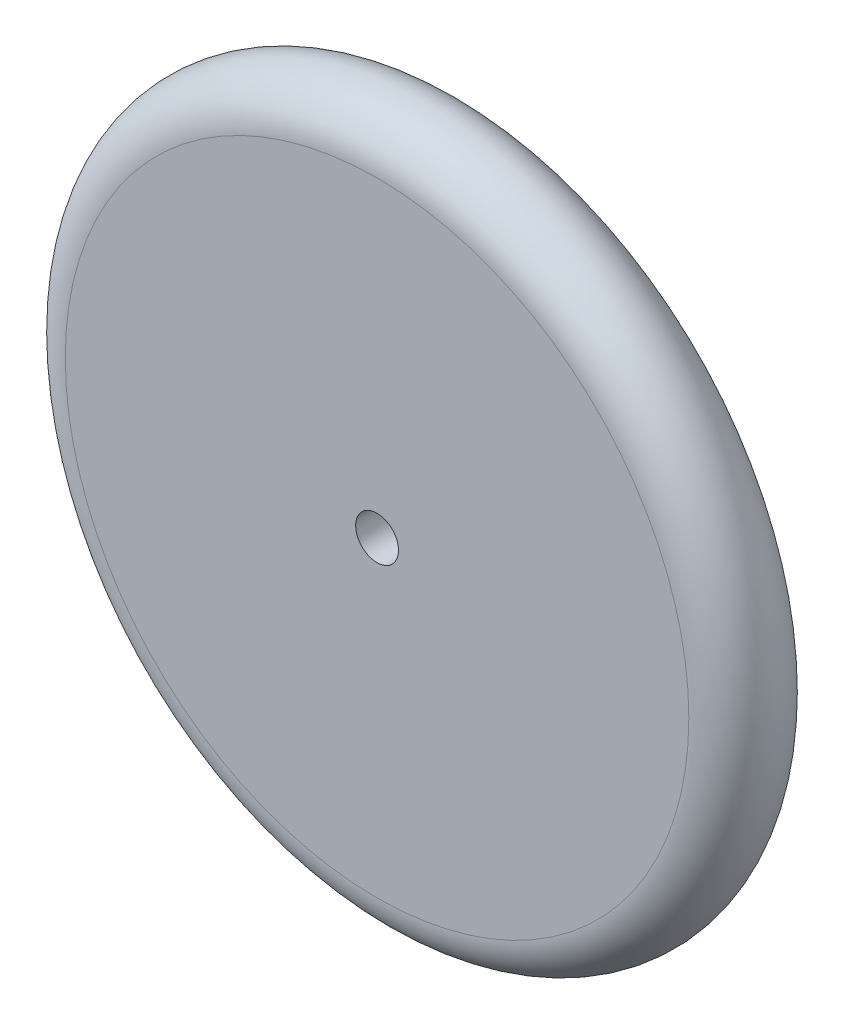
ISO-10303-21;
HEADER;
FILE_DESCRIPTION(('STEP AP214'),'2;1');
FILE_NAME('part.step','',(''),(''),'','','');
FILE_SCHEMA(('AUTOMOTIVE_DESIGN { 1 0 10303 214 1 1 1 1 }'));
ENDSEC;
DATA;
#1=APPLICATION_CONTEXT('core data for automotive mechanical design processes');
#2=APPLICATION_PROTOCOL_DEFINITION('international standard','automotive_design',2000,#1);
#3=PRODUCT_CONTEXT('',#1,'mechanical');
#4=PRODUCT('Part','Part','',(#3));
#5=PRODUCT_RELATED_PRODUCT_CATEGORY('part','',(#4));
#6=PRODUCT_DEFINITION_FORMATION('','',#4);
#7=PRODUCT_DEFINITION_CONTEXT('part definition',#1,'design');
#8=PRODUCT_DEFINITION('design','',#6,#7);
#9=PRODUCT_DEFINITION_SHAPE('','',#8);
#10=(LENGTH_UNIT() NAMED_UNIT(*) SI_UNIT(.MILLI.,.METRE.));
#11=(NAMED_UNIT(*) PLANE_ANGLE_UNIT() SI_UNIT($,.RADIAN.));
#12=(NAMED_UNIT(*) SI_UNIT($,.STERADIAN.) SOLID_ANGLE_UNIT());
#13=UNCERTAINTY_MEASURE_WITH_UNIT(LENGTH_MEASURE(1.E-05),#10,'distance_accuracy_value','');
#14=(GEOMETRIC_REPRESENTATION_CONTEXT(3) GLOBAL_UNCERTAINTY_ASSIGNED_CONTEXT((#13)) GLOBAL_UNIT_ASSIGNED_CONTEXT((#10,
#11,#12)) REPRESENTATION_CONTEXT('',''));
#15=CARTESIAN_POINT('',(0.,0.,0.));
#16=DIRECTION('',(0.,0.,1.));
#17=DIRECTION('',(1.,0.,0.));
#18=AXIS2_PLACEMENT_3D('',#15,#16,#17);
#19=CARTESIAN_POINT('',(0.,0.,20.));
#20=DIRECTION('',(0.,0.,1.));
#21=DIRECTION('',(1.,0.,0.));
#22=AXIS2_PLACEMENT_3D('',#19,#20,#21);
#23=TOROIDAL_SURFACE('',#22,138.75,20.);
#24=CARTESIAN_POINT('',(0.,0.,40.));
#25=DIRECTION('',(0.,0.,1.));
#26=DIRECTION('',(1.,0.,0.));
#27=AXIS2_PLACEMENT_3D('',#24,#25,#26);
#28=CIRCLE('',#27,138.75);
#29=CARTESIAN_POINT('',(138.75,0.,40.));
#30=VERTEX_POINT('',#29);
#31=EDGE_CURVE('E37',#30,#30,#28,.T.);
#32=ORIENTED_EDGE('',*,*,#31,.F.);
#33=EDGE_LOOP('',(#32));
#34=FACE_BOUND('',#33,.T.);
#35=CARTESIAN_POINT('',(0.,0.,0.));
#36=DIRECTION('',(0.,0.,1.));
#37=DIRECTION('',(1.,0.,0.));
#38=AXIS2_PLACEMENT_3D('',#35,#36,#37);
#39=CIRCLE('',#38,138.75);
#40=CARTESIAN_POINT('',(138.75,0.,0.));
#41=VERTEX_POINT('',#40);
#42=EDGE_CURVE('E10',#41,#41,#39,.F.);
#43=ORIENTED_EDGE('',*,*,#42,.F.);
#44=EDGE_LOOP('',(#43));
#45=FACE_BOUND('',#44,.T.);
#46=ADVANCED_FACE('F31',(#34,#45),#23,.T.);
#47=CARTESIAN_POINT('',(0.,0.,40.));
#48=DIRECTION('',(0.,0.,1.));
#49=DIRECTION('',(1.,0.,0.));
#50=AXIS2_PLACEMENT_3D('',#47,#48,#49);
#51=PLANE('',#50);
#52=ORIENTED_EDGE('',*,*,#31,.T.);
#53=EDGE_LOOP('',(#52));
#54=FACE_BOUND('',#53,.T.);
#55=CARTESIAN_POINT('',(0.,0.,40.));
#56=DIRECTION('',(0.,0.,1.));
#57=DIRECTION('',(1.,0.,0.));
#58=AXIS2_PLACEMENT_3D('',#55,#56,#57);
#59=CIRCLE('',#58,9.525);
#60=CARTESIAN_POINT('',(9.525,0.,40.));
#61=VERTEX_POINT('',#60);
#62=EDGE_CURVE('E41',#61,#61,#59,.T.);
#63=ORIENTED_EDGE('',*,*,#62,.F.);
#64=EDGE_LOOP('',(#63));
#65=FACE_BOUND('',#64,.T.);
#66=ADVANCED_FACE('F60',(#54,#65),#51,.T.);
#67=CARTESIAN_POINT('',(0.,0.,0.));
#68=DIRECTION('',(0.,0.,1.));
#69=DIRECTION('',(1.,0.,0.));
#70=AXIS2_PLACEMENT_3D('',#67,#68,#69);
#71=PLANE('',#70);
#72=ORIENTED_EDGE('',*,*,#42,.T.);
#73=EDGE_LOOP('',(#72));
#74=FACE_BOUND('',#73,.T.);
#75=CARTESIAN_POINT('',(0.,0.,0.));
#76=DIRECTION('',(0.,0.,1.));
#77=DIRECTION('',(1.,0.,0.));
#78=AXIS2_PLACEMENT_3D('',#75,#76,#77);
#79=CIRCLE('',#78,9.525);
#80=CARTESIAN_POINT('',(9.525,0.,0.));
#81=VERTEX_POINT('',#80);
#82=EDGE_CURVE('E45',#81,#81,#79,.T.);
#83=ORIENTED_EDGE('',*,*,#82,.T.);
#84=EDGE_LOOP('',(#83));
#85=FACE_BOUND('',#84,.T.);
#86=ADVANCED_FACE('F51',(#74,#85),#71,.F.);
#87=CARTESIAN_POINT('',(0.,0.,40.));
#88=DIRECTION('',(0.,0.,-1.));
#89=DIRECTION('',(-1.,0.,0.));
#90=AXIS2_PLACEMENT_3D('',#87,#88,#89);
#91=CYLINDRICAL_SURFACE('',#90,9.525);
#92=ORIENTED_EDGE('',*,*,#62,.T.);
#93=EDGE_LOOP('',(#92));
#94=FACE_BOUND('',#93,.T.);
#95=ORIENTED_EDGE('',*,*,#82,.F.);
#96=EDGE_LOOP('',(#95));
#97=FACE_BOUND('',#96,.T.);
#98=ADVANCED_FACE('F53',(#94,#97),#91,.F.);
#99=CLOSED_SHELL('',(#46,#66,#86,#98));
#100=MANIFOLD_SOLID_BREP('B2',#99);
#101=ADVANCED_BREP_SHAPE_REPRESENTATION('',(#18,#100),#14);
#102=SHAPE_DEFINITION_REPRESENTATION(#9,#101);
ENDSEC;
END-ISO-10303-21;
